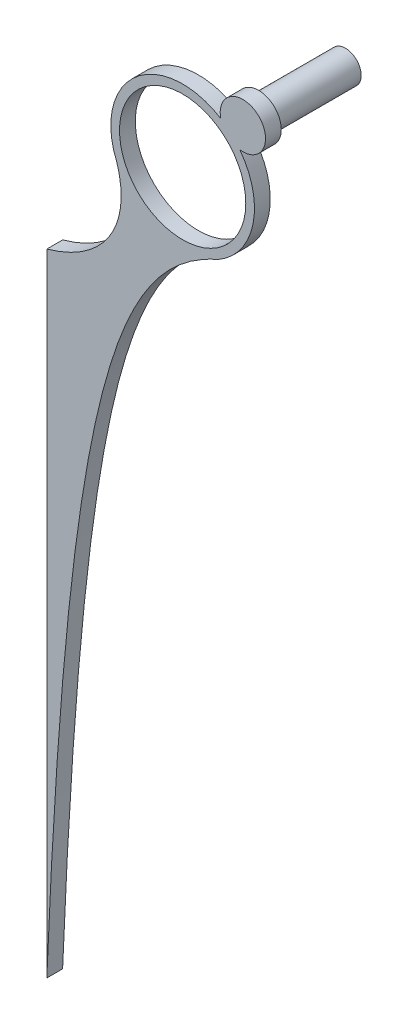
ISO-10303-21;
HEADER;
FILE_DESCRIPTION(('STEP AP214'),'2;1');
FILE_NAME('part.step','',(''),(''),'','','');
FILE_SCHEMA(('AUTOMOTIVE_DESIGN { 1 0 10303 214 1 1 1 1 }'));
ENDSEC;
DATA;
#1=APPLICATION_CONTEXT('core data for automotive mechanical design processes');
#2=APPLICATION_PROTOCOL_DEFINITION('international standard','automotive_design',2000,#1);
#3=PRODUCT_CONTEXT('',#1,'mechanical');
#4=PRODUCT('Part','Part','',(#3));
#5=PRODUCT_RELATED_PRODUCT_CATEGORY('part','',(#4));
#6=PRODUCT_DEFINITION_FORMATION('','',#4);
#7=PRODUCT_DEFINITION_CONTEXT('part definition',#1,'design');
#8=PRODUCT_DEFINITION('design','',#6,#7);
#9=PRODUCT_DEFINITION_SHAPE('','',#8);
#10=(LENGTH_UNIT() NAMED_UNIT(*) SI_UNIT(.MILLI.,.METRE.));
#11=(NAMED_UNIT(*) PLANE_ANGLE_UNIT() SI_UNIT($,.RADIAN.));
#12=(NAMED_UNIT(*) SI_UNIT($,.STERADIAN.) SOLID_ANGLE_UNIT());
#13=UNCERTAINTY_MEASURE_WITH_UNIT(LENGTH_MEASURE(1.E-05),#10,'distance_accuracy_value','');
#14=(GEOMETRIC_REPRESENTATION_CONTEXT(3) GLOBAL_UNCERTAINTY_ASSIGNED_CONTEXT((#13)) GLOBAL_UNIT_ASSIGNED_CONTEXT((#10,
#11,#12)) REPRESENTATION_CONTEXT('',''));
#15=CARTESIAN_POINT('',(0.,0.,0.));
#16=DIRECTION('',(0.,0.,1.));
#17=DIRECTION('',(1.,0.,0.));
#18=AXIS2_PLACEMENT_3D('',#15,#16,#17);
#19=CARTESIAN_POINT('',(24.84029944,25.96453493,-11.));
#20=DIRECTION('',(0.,0.,1.));
#21=DIRECTION('',(1.,0.,0.));
#22=AXIS2_PLACEMENT_3D('',#19,#20,#21);
#23=CYLINDRICAL_SURFACE('',#22,2.);
#24=CARTESIAN_POINT('',(24.84029944,25.96453493,-11.));
#25=DIRECTION('',(0.,0.,-1.));
#26=DIRECTION('',(-1.,0.,0.));
#27=AXIS2_PLACEMENT_3D('',#24,#25,#26);
#28=CIRCLE('',#27,2.);
#29=CARTESIAN_POINT('',(22.84029944,25.96453493,-11.));
#30=VERTEX_POINT('',#29);
#31=EDGE_CURVE('E11',#30,#30,#28,.T.);
#32=ORIENTED_EDGE('',*,*,#31,.F.);
#33=EDGE_LOOP('',(#32));
#34=FACE_BOUND('',#33,.T.);
#35=CARTESIAN_POINT('',(24.84029944,25.96453493,0.));
#36=DIRECTION('',(0.,0.,-1.));
#37=DIRECTION('',(-1.,0.,0.));
#38=AXIS2_PLACEMENT_3D('',#35,#36,#37);
#39=CIRCLE('',#38,2.);
#40=CARTESIAN_POINT('',(22.84029944,25.96453493,0.));
#41=VERTEX_POINT('',#40);
#42=EDGE_CURVE('E50',#41,#41,#39,.T.);
#43=ORIENTED_EDGE('',*,*,#42,.T.);
#44=EDGE_LOOP('',(#43));
#45=FACE_BOUND('',#44,.T.);
#46=ADVANCED_FACE('F47',(#34,#45),#23,.T.);
#47=CARTESIAN_POINT('',(24.84029944,25.96453493,-11.));
#48=DIRECTION('',(0.,0.,-1.));
#49=DIRECTION('',(-1.,0.,0.));
#50=AXIS2_PLACEMENT_3D('',#47,#48,#49);
#51=PLANE('',#50);
#52=ORIENTED_EDGE('',*,*,#31,.T.);
#53=EDGE_LOOP('',(#52));
#54=FACE_BOUND('',#53,.T.);
#55=ADVANCED_FACE('F62',(#54),#51,.T.);
#56=CARTESIAN_POINT('',(24.84029944,25.96453493,0.));
#57=DIRECTION('',(0.,0.,-1.));
#58=DIRECTION('',(-1.,0.,0.));
#59=AXIS2_PLACEMENT_3D('',#56,#57,#58);
#60=PLANE('',#59);
#61=ORIENTED_EDGE('',*,*,#42,.F.);
#62=EDGE_LOOP('',(#61));
#63=FACE_BOUND('',#62,.T.);
#64=ADVANCED_FACE('F60',(#63),#60,.F.);
#65=CLOSED_SHELL('',(#46,#55,#64));
#66=MANIFOLD_SOLID_BREP('B2',#65);
#67=CARTESIAN_POINT('',(17.2116429265685,17.620858295339,2.));
#68=DIRECTION('',(0.,0.,-1.));
#69=DIRECTION('',(-1.,0.,0.));
#70=AXIS2_PLACEMENT_3D('',#67,#68,#69);
#71=CYLINDRICAL_SURFACE('',#70,9.1022372693234);
#72=CARTESIAN_POINT('',(17.2116429265685,17.620858295339,0.));
#73=DIRECTION('',(0.,0.,1.));
#74=DIRECTION('',(1.,0.,0.));
#75=AXIS2_PLACEMENT_3D('',#72,#73,#74);
#76=CIRCLE('',#75,9.1022372693234);
#77=CARTESIAN_POINT('',(21.7057775921539,9.70546336427944,0.));
#78=VERTEX_POINT('',#77);
#79=CARTESIAN_POINT('',(24.4663761580512,23.1180911489737,0.));
#80=VERTEX_POINT('',#79);
#81=EDGE_CURVE('E153',#78,#80,#76,.T.);
#82=ORIENTED_EDGE('',*,*,#81,.T.);
#83=DIRECTION('',(0.,0.,-1.));
#84=VECTOR('',#83,1.);
#85=CARTESIAN_POINT('',(24.4663761580512,23.1180911489737,1.));
#86=LINE('',#85,#84);
#87=CARTESIAN_POINT('',(24.4663761580512,23.1180911489737,2.));
#88=VERTEX_POINT('',#87);
#89=EDGE_CURVE('E111',#80,#88,#86,.F.);
#90=ORIENTED_EDGE('',*,*,#89,.T.);
#91=CARTESIAN_POINT('',(17.2116429265685,17.620858295339,2.));
#92=DIRECTION('',(0.,0.,1.));
#93=DIRECTION('',(1.,0.,0.));
#94=AXIS2_PLACEMENT_3D('',#91,#92,#93);
#95=CIRCLE('',#94,9.1022372693234);
#96=CARTESIAN_POINT('',(21.7057775921539,9.70546336427944,2.));
#97=VERTEX_POINT('',#96);
#98=EDGE_CURVE('E178',#97,#88,#95,.T.);
#99=ORIENTED_EDGE('',*,*,#98,.F.);
#100=DIRECTION('',(0.,0.,-1.));
#101=VECTOR('',#100,1.);
#102=CARTESIAN_POINT('',(21.7057775921539,9.70546336427944,2.));
#103=LINE('',#102,#101);
#104=EDGE_CURVE('E96',#97,#78,#103,.T.);
#105=ORIENTED_EDGE('',*,*,#104,.T.);
#106=EDGE_LOOP('',(#82,#90,#99,#105));
#107=FACE_BOUND('',#106,.T.);
#108=ADVANCED_FACE('F88',(#107),#71,.T.);
#109=CARTESIAN_POINT('',(0.,0.,2.));
#110=DIRECTION('',(1.,0.,0.));
#111=DIRECTION('',(0.,1.,0.));
#112=AXIS2_PLACEMENT_3D('',#109,#110,#111);
#113=PLANE('',#112);
#114=DIRECTION('',(0.,-1.,0.));
#115=VECTOR('',#114,1.);
#116=CARTESIAN_POINT('',(0.,0.,0.));
#117=LINE('',#116,#115);
#118=CARTESIAN_POINT('',(0.,0.,0.));
#119=VERTEX_POINT('',#118);
#120=CARTESIAN_POINT('',(0.,-80.,0.));
#121=VERTEX_POINT('',#120);
#122=EDGE_CURVE('E168',#119,#121,#117,.T.);
#123=ORIENTED_EDGE('',*,*,#122,.T.);
#124=DIRECTION('',(0.,0.,-1.));
#125=VECTOR('',#124,1.);
#126=CARTESIAN_POINT('',(0.,-80.,2.));
#127=LINE('',#126,#125);
#128=CARTESIAN_POINT('',(0.,-80.,2.));
#129=VERTEX_POINT('',#128);
#130=EDGE_CURVE('E45',#129,#121,#127,.T.);
#131=ORIENTED_EDGE('',*,*,#130,.F.);
#132=DIRECTION('',(0.,-1.,0.));
#133=VECTOR('',#132,1.);
#134=CARTESIAN_POINT('',(0.,0.,2.));
#135=LINE('',#134,#133);
#136=CARTESIAN_POINT('',(0.,0.,2.));
#137=VERTEX_POINT('',#136);
#138=EDGE_CURVE('E169',#137,#129,#135,.T.);
#139=ORIENTED_EDGE('',*,*,#138,.F.);
#140=DIRECTION('',(0.,0.,-1.));
#141=VECTOR('',#140,1.);
#142=CARTESIAN_POINT('',(0.,0.,2.));
#143=LINE('',#142,#141);
#144=EDGE_CURVE('E207',#137,#119,#143,.T.);
#145=ORIENTED_EDGE('',*,*,#144,.T.);
#146=EDGE_LOOP('',(#123,#131,#139,#145));
#147=FACE_BOUND('',#146,.T.);
#148=ADVANCED_FACE('F90',(#147),#113,.F.);
#149=CARTESIAN_POINT('',(0.,-80.,2.));
#150=CARTESIAN_POINT('',(2.76773681233328,-12.9824531878963,2.));
#151=CARTESIAN_POINT('',(8.84819972299054,4.11965741412819,2.));
#152=CARTESIAN_POINT('',(21.7057775921539,9.70546336427943,2.));
#153=B_SPLINE_CURVE_WITH_KNOTS('',3,(#149,#150,#151,#152),.UNSPECIFIED.,.F.,.F.,(4,4),(0.,1.),.UNSPECIFIED.);
#154=DIRECTION('',(0.,0.,-1.));
#155=VECTOR('',#154,1.);
#156=SURFACE_OF_LINEAR_EXTRUSION('',#153,#155);
#157=CARTESIAN_POINT('',(0.,-80.,0.));
#158=CARTESIAN_POINT('',(2.76773681233328,-12.9824531878963,0.));
#159=CARTESIAN_POINT('',(8.84819972299054,4.11965741412819,0.));
#160=CARTESIAN_POINT('',(21.7057775921539,9.70546336427943,0.));
#161=B_SPLINE_CURVE_WITH_KNOTS('',3,(#157,#158,#159,#160),.UNSPECIFIED.,.F.,.F.,(4,4),(0.,1.),.UNSPECIFIED.);
#162=EDGE_CURVE('E154',#121,#78,#161,.T.);
#163=ORIENTED_EDGE('',*,*,#162,.T.);
#164=ORIENTED_EDGE('',*,*,#104,.F.);
#165=EDGE_CURVE('E172',#129,#97,#153,.T.);
#166=ORIENTED_EDGE('',*,*,#165,.F.);
#167=ORIENTED_EDGE('',*,*,#130,.T.);
#168=EDGE_LOOP('',(#163,#164,#166,#167));
#169=FACE_BOUND('',#168,.T.);
#170=ADVANCED_FACE('F183',(#169),#156,.F.);
#171=CARTESIAN_POINT('',(22.0386527102114,25.3377682893506,2.));
#172=VERTEX_POINT('',#171);
#173=CARTESIAN_POINT('',(8.84501699450518,14.0361276471612,2.));
#174=VERTEX_POINT('',#173);
#175=EDGE_CURVE('E103',#172,#174,#95,.T.);
#176=ORIENTED_EDGE('',*,*,#175,.F.);
#177=DIRECTION('',(0.,0.,-1.));
#178=VECTOR('',#177,1.);
#179=CARTESIAN_POINT('',(22.0386527102114,25.3377682893506,1.));
#180=LINE('',#179,#178);
#181=CARTESIAN_POINT('',(22.0386527102114,25.3377682893506,0.));
#182=VERTEX_POINT('',#181);
#183=EDGE_CURVE('E156',#172,#182,#180,.T.);
#184=ORIENTED_EDGE('',*,*,#183,.T.);
#185=CARTESIAN_POINT('',(8.84501699450518,14.0361276471612,0.));
#186=VERTEX_POINT('',#185);
#187=EDGE_CURVE('E143',#182,#186,#76,.T.);
#188=ORIENTED_EDGE('',*,*,#187,.T.);
#189=DIRECTION('',(0.,0.,-1.));
#190=VECTOR('',#189,1.);
#191=CARTESIAN_POINT('',(8.84501699450518,14.0361276471612,2.));
#192=LINE('',#191,#190);
#193=EDGE_CURVE('E225',#174,#186,#192,.T.);
#194=ORIENTED_EDGE('',*,*,#193,.F.);
#195=EDGE_LOOP('',(#176,#184,#188,#194));
#196=FACE_BOUND('',#195,.T.);
#197=ADVANCED_FACE('F157',(#196),#71,.T.);
#198=CARTESIAN_POINT('',(0.,0.,2.));
#199=CARTESIAN_POINT('',(7.61914050188339,2.1521105851723,2.));
#200=CARTESIAN_POINT('',(10.8356519923622,7.8832226368998,2.));
#201=CARTESIAN_POINT('',(8.84501699450518,14.0361276471612,2.));
#202=B_SPLINE_CURVE_WITH_KNOTS('',3,(#198,#199,#200,#201),.UNSPECIFIED.,.F.,.F.,(4,4),(0.,1.),.UNSPECIFIED.);
#203=DIRECTION('',(0.,0.,-1.));
#204=VECTOR('',#203,1.);
#205=SURFACE_OF_LINEAR_EXTRUSION('',#202,#204);
#206=CARTESIAN_POINT('',(0.,0.,0.));
#207=CARTESIAN_POINT('',(7.61914050188339,2.1521105851723,0.));
#208=CARTESIAN_POINT('',(10.8356519923622,7.8832226368998,0.));
#209=CARTESIAN_POINT('',(8.84501699450518,14.0361276471612,0.));
#210=B_SPLINE_CURVE_WITH_KNOTS('',3,(#206,#207,#208,#209),.UNSPECIFIED.,.F.,.F.,(4,4),(0.,1.),.UNSPECIFIED.);
#211=EDGE_CURVE('E151',#119,#186,#210,.T.);
#212=ORIENTED_EDGE('',*,*,#211,.F.);
#213=ORIENTED_EDGE('',*,*,#144,.F.);
#214=EDGE_CURVE('E195',#137,#174,#202,.T.);
#215=ORIENTED_EDGE('',*,*,#214,.T.);
#216=ORIENTED_EDGE('',*,*,#193,.T.);
#217=EDGE_LOOP('',(#212,#213,#215,#216));
#218=FACE_BOUND('',#217,.T.);
#219=ADVANCED_FACE('F189',(#218),#205,.T.);
#220=CARTESIAN_POINT('',(17.2116429265685,17.620858295339,2.));
#221=DIRECTION('',(0.,0.,-1.));
#222=DIRECTION('',(-1.,0.,0.));
#223=AXIS2_PLACEMENT_3D('',#220,#221,#222);
#224=CYLINDRICAL_SURFACE('',#223,8.);
#225=CARTESIAN_POINT('',(17.2116429265685,17.620858295339,2.));
#226=DIRECTION('',(0.,0.,1.));
#227=DIRECTION('',(1.,0.,0.));
#228=AXIS2_PLACEMENT_3D('',#225,#226,#227);
#229=CIRCLE('',#228,8.);
#230=CARTESIAN_POINT('',(25.2116429265685,17.620858295339,2.));
#231=VERTEX_POINT('',#230);
#232=EDGE_CURVE('E201',#231,#231,#229,.T.);
#233=ORIENTED_EDGE('',*,*,#232,.T.);
#234=EDGE_LOOP('',(#233));
#235=FACE_BOUND('',#234,.T.);
#236=CARTESIAN_POINT('',(17.2116429265685,17.620858295339,0.));
#237=DIRECTION('',(0.,0.,1.));
#238=DIRECTION('',(1.,0.,0.));
#239=AXIS2_PLACEMENT_3D('',#236,#237,#238);
#240=CIRCLE('',#239,8.);
#241=CARTESIAN_POINT('',(25.2116429265685,17.620858295339,0.));
#242=VERTEX_POINT('',#241);
#243=EDGE_CURVE('E173',#242,#242,#240,.T.);
#244=ORIENTED_EDGE('',*,*,#243,.F.);
#245=EDGE_LOOP('',(#244));
#246=FACE_BOUND('',#245,.T.);
#247=ADVANCED_FACE('F192',(#235,#246),#224,.F.);
#248=CARTESIAN_POINT('',(0.,0.,2.));
#249=DIRECTION('',(0.,0.,1.));
#250=DIRECTION('',(1.,0.,0.));
#251=AXIS2_PLACEMENT_3D('',#248,#249,#250);
#252=PLANE('',#251);
#253=ORIENTED_EDGE('',*,*,#98,.T.);
#254=CARTESIAN_POINT('',(24.8402994440346,25.9645349346469,2.));
#255=DIRECTION('',(0.,0.,-1.));
#256=DIRECTION('',(-1.,0.,0.));
#257=AXIS2_PLACEMENT_3D('',#254,#255,#256);
#258=CIRCLE('',#257,2.87089896178848);
#259=EDGE_CURVE('E161',#172,#88,#258,.T.);
#260=ORIENTED_EDGE('',*,*,#259,.F.);
#261=ORIENTED_EDGE('',*,*,#175,.T.);
#262=ORIENTED_EDGE('',*,*,#214,.F.);
#263=ORIENTED_EDGE('',*,*,#138,.T.);
#264=ORIENTED_EDGE('',*,*,#165,.T.);
#265=EDGE_LOOP('',(#253,#260,#261,#262,#263,#264));
#266=FACE_BOUND('',#265,.T.);
#267=ORIENTED_EDGE('',*,*,#232,.F.);
#268=EDGE_LOOP('',(#267));
#269=FACE_BOUND('',#268,.T.);
#270=ADVANCED_FACE('F233',(#266,#269),#252,.T.);
#271=CARTESIAN_POINT('',(0.,0.,0.));
#272=DIRECTION('',(0.,0.,1.));
#273=DIRECTION('',(1.,0.,0.));
#274=AXIS2_PLACEMENT_3D('',#271,#272,#273);
#275=PLANE('',#274);
#276=ORIENTED_EDGE('',*,*,#187,.F.);
#277=CARTESIAN_POINT('',(24.8402994440346,25.9645349346469,0.));
#278=DIRECTION('',(0.,0.,-1.));
#279=DIRECTION('',(-1.,0.,0.));
#280=AXIS2_PLACEMENT_3D('',#277,#278,#279);
#281=CIRCLE('',#280,2.87089896178848);
#282=EDGE_CURVE('E148',#182,#80,#281,.T.);
#283=ORIENTED_EDGE('',*,*,#282,.T.);
#284=ORIENTED_EDGE('',*,*,#81,.F.);
#285=ORIENTED_EDGE('',*,*,#162,.F.);
#286=ORIENTED_EDGE('',*,*,#122,.F.);
#287=ORIENTED_EDGE('',*,*,#211,.T.);
#288=EDGE_LOOP('',(#276,#283,#284,#285,#286,#287));
#289=FACE_BOUND('',#288,.T.);
#290=ORIENTED_EDGE('',*,*,#243,.T.);
#291=EDGE_LOOP('',(#290));
#292=FACE_BOUND('',#291,.T.);
#293=ADVANCED_FACE('F144',(#289,#292),#275,.F.);
#294=CARTESIAN_POINT('',(24.8402994440346,25.9645349346469,2.));
#295=DIRECTION('',(0.,0.,-1.));
#296=DIRECTION('',(-1.,0.,0.));
#297=AXIS2_PLACEMENT_3D('',#294,#295,#296);
#298=CYLINDRICAL_SURFACE('',#297,2.87089896178848);
#299=ORIENTED_EDGE('',*,*,#89,.F.);
#300=ORIENTED_EDGE('',*,*,#282,.F.);
#301=ORIENTED_EDGE('',*,*,#183,.F.);
#302=ORIENTED_EDGE('',*,*,#259,.T.);
#303=EDGE_LOOP('',(#299,#300,#301,#302));
#304=FACE_BOUND('',#303,.T.);
#305=ADVANCED_FACE('F163',(#304),#298,.T.);
#306=CLOSED_SHELL('',(#108,#148,#170,#197,#219,#247,#270,#293,#305));
#307=MANIFOLD_SOLID_BREP('B6',#306);
#308=ADVANCED_BREP_SHAPE_REPRESENTATION('',(#18,#66,#307),#14);
#309=SHAPE_DEFINITION_REPRESENTATION(#9,#308);
ENDSEC;
END-ISO-10303-21;
